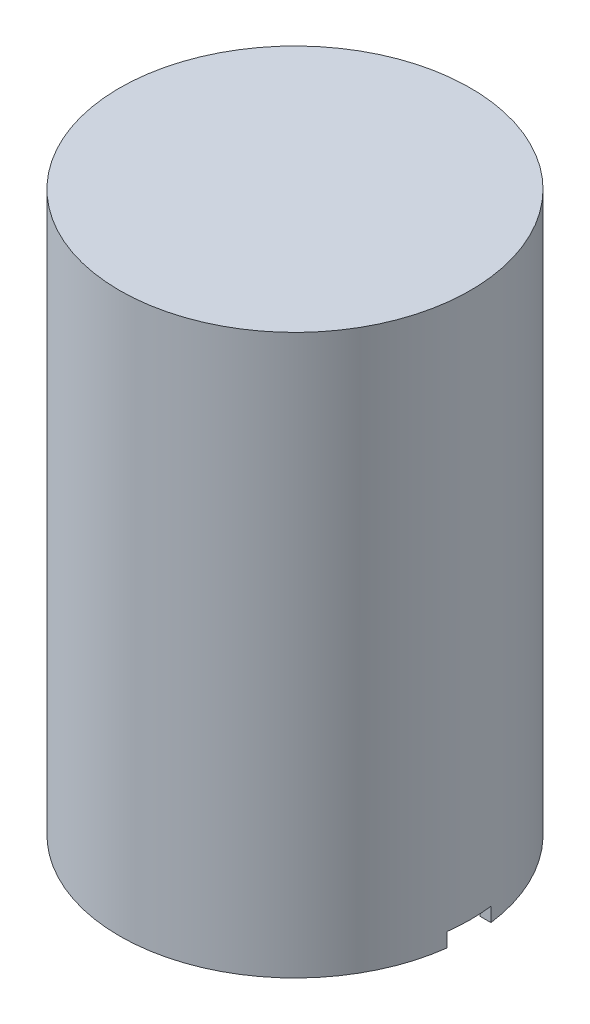
ISO-10303-21;
HEADER;
FILE_DESCRIPTION(('STEP AP214'),'2;1');
FILE_NAME('part.step','',(''),(''),'','','');
FILE_SCHEMA(('AUTOMOTIVE_DESIGN { 1 0 10303 214 1 1 1 1 }'));
ENDSEC;
DATA;
#1=APPLICATION_CONTEXT('core data for automotive mechanical design processes');
#2=APPLICATION_PROTOCOL_DEFINITION('international standard','automotive_design',2000,#1);
#3=PRODUCT_CONTEXT('',#1,'mechanical');
#4=PRODUCT('Part','Part','',(#3));
#5=PRODUCT_RELATED_PRODUCT_CATEGORY('part','',(#4));
#6=PRODUCT_DEFINITION_FORMATION('','',#4);
#7=PRODUCT_DEFINITION_CONTEXT('part definition',#1,'design');
#8=PRODUCT_DEFINITION('design','',#6,#7);
#9=PRODUCT_DEFINITION_SHAPE('','',#8);
#10=(LENGTH_UNIT() NAMED_UNIT(*) SI_UNIT(.MILLI.,.METRE.));
#11=(NAMED_UNIT(*) PLANE_ANGLE_UNIT() SI_UNIT($,.RADIAN.));
#12=(NAMED_UNIT(*) SI_UNIT($,.STERADIAN.) SOLID_ANGLE_UNIT());
#13=UNCERTAINTY_MEASURE_WITH_UNIT(LENGTH_MEASURE(1.E-05),#10,'distance_accuracy_value','');
#14=(GEOMETRIC_REPRESENTATION_CONTEXT(3) GLOBAL_UNCERTAINTY_ASSIGNED_CONTEXT((#13)) GLOBAL_UNIT_ASSIGNED_CONTEXT((#10,
#11,#12)) REPRESENTATION_CONTEXT('',''));
#15=CARTESIAN_POINT('',(0.,0.,0.));
#16=DIRECTION('',(0.,0.,1.));
#17=DIRECTION('',(1.,0.,0.));
#18=AXIS2_PLACEMENT_3D('',#15,#16,#17);
#19=CARTESIAN_POINT('',(0.,0.,0.));
#20=DIRECTION('',(0.,1.,0.));
#21=DIRECTION('',(0.,0.,1.));
#22=AXIS2_PLACEMENT_3D('',#19,#20,#21);
#23=PLANE('',#22);
#24=DIRECTION('',(1.,0.,0.));
#25=VECTOR('',#24,1.);
#26=CARTESIAN_POINT('',(0.,0.,-4.));
#27=LINE('',#26,#25);
#28=CARTESIAN_POINT('',(-31.7490157327751,0.,-4.));
#29=VERTEX_POINT('',#28);
#30=CARTESIAN_POINT('',(-29.7573625343376,0.,-4.));
#31=VERTEX_POINT('',#30);
#32=EDGE_CURVE('E56',#29,#31,#27,.T.);
#33=ORIENTED_EDGE('',*,*,#32,.F.);
#34=CARTESIAN_POINT('',(0.,0.,0.));
#35=DIRECTION('',(0.,1.,0.));
#36=DIRECTION('',(0.,0.,1.));
#37=AXIS2_PLACEMENT_3D('',#34,#35,#36);
#38=CIRCLE('',#37,32.);
#39=CARTESIAN_POINT('',(31.7490157327751,0.,-4.));
#40=VERTEX_POINT('',#39);
#41=EDGE_CURVE('E139',#40,#29,#38,.T.);
#42=ORIENTED_EDGE('',*,*,#41,.F.);
#43=CARTESIAN_POINT('',(29.7573625343376,0.,-4.));
#44=VERTEX_POINT('',#43);
#45=EDGE_CURVE('E99',#44,#40,#27,.T.);
#46=ORIENTED_EDGE('',*,*,#45,.F.);
#47=CARTESIAN_POINT('',(0.,0.,0.));
#48=DIRECTION('',(0.,-1.,0.));
#49=DIRECTION('',(0.,0.,-1.));
#50=AXIS2_PLACEMENT_3D('',#47,#48,#49);
#51=CIRCLE('',#50,30.025);
#52=EDGE_CURVE('E125',#31,#44,#51,.T.);
#53=ORIENTED_EDGE('',*,*,#52,.F.);
#54=EDGE_LOOP('',(#33,#42,#46,#53));
#55=FACE_BOUND('',#54,.T.);
#56=ADVANCED_FACE('F33',(#55),#23,.F.);
#57=CARTESIAN_POINT('',(0.,100.,0.));
#58=DIRECTION('',(0.,-1.,0.));
#59=DIRECTION('',(0.,0.,-1.));
#60=AXIS2_PLACEMENT_3D('',#57,#58,#59);
#61=CYLINDRICAL_SURFACE('',#60,32.);
#62=CARTESIAN_POINT('',(0.,2.59058077848007,0.));
#63=DIRECTION('',(0.,-1.,0.));
#64=DIRECTION('',(0.,0.,-1.));
#65=AXIS2_PLACEMENT_3D('',#62,#63,#64);
#66=CIRCLE('',#65,32.);
#67=CARTESIAN_POINT('',(-31.7490157327751,2.59058077848007,4.));
#68=VERTEX_POINT('',#67);
#69=CARTESIAN_POINT('',(-31.7490157327751,2.59058077848007,-4.));
#70=VERTEX_POINT('',#69);
#71=EDGE_CURVE('E122',#68,#70,#66,.T.);
#72=ORIENTED_EDGE('',*,*,#71,.F.);
#73=DIRECTION('',(0.,-1.,0.));
#74=VECTOR('',#73,1.);
#75=CARTESIAN_POINT('',(-31.7490157327751,100.,4.));
#76=LINE('',#75,#74);
#77=CARTESIAN_POINT('',(-31.7490157327751,0.,4.));
#78=VERTEX_POINT('',#77);
#79=EDGE_CURVE('E127',#68,#78,#76,.T.);
#80=ORIENTED_EDGE('',*,*,#79,.T.);
#81=CARTESIAN_POINT('',(31.7490157327751,0.,4.));
#82=VERTEX_POINT('',#81);
#83=EDGE_CURVE('E134',#78,#82,#38,.T.);
#84=ORIENTED_EDGE('',*,*,#83,.T.);
#85=DIRECTION('',(0.,-1.,0.));
#86=VECTOR('',#85,1.);
#87=CARTESIAN_POINT('',(31.7490157327751,100.,4.));
#88=LINE('',#87,#86);
#89=CARTESIAN_POINT('',(31.7490157327751,2.59058077848007,4.));
#90=VERTEX_POINT('',#89);
#91=EDGE_CURVE('E120',#82,#90,#88,.F.);
#92=ORIENTED_EDGE('',*,*,#91,.T.);
#93=CARTESIAN_POINT('',(31.7490157327751,2.59058077848007,-4.));
#94=VERTEX_POINT('',#93);
#95=EDGE_CURVE('E108',#94,#90,#66,.T.);
#96=ORIENTED_EDGE('',*,*,#95,.F.);
#97=DIRECTION('',(0.,-1.,0.));
#98=VECTOR('',#97,1.);
#99=CARTESIAN_POINT('',(31.7490157327751,100.,-4.));
#100=LINE('',#99,#98);
#101=EDGE_CURVE('E96',#40,#94,#100,.F.);
#102=ORIENTED_EDGE('',*,*,#101,.F.);
#103=ORIENTED_EDGE('',*,*,#41,.T.);
#104=DIRECTION('',(0.,-1.,0.));
#105=VECTOR('',#104,1.);
#106=CARTESIAN_POINT('',(-31.7490157327751,100.,-4.));
#107=LINE('',#106,#105);
#108=EDGE_CURVE('E171',#70,#29,#107,.T.);
#109=ORIENTED_EDGE('',*,*,#108,.F.);
#110=EDGE_LOOP('',(#72,#80,#84,#92,#96,#102,#103,#109));
#111=FACE_BOUND('',#110,.T.);
#112=CARTESIAN_POINT('',(0.,102.,0.));
#113=DIRECTION('',(0.,1.,0.));
#114=DIRECTION('',(0.,0.,1.));
#115=AXIS2_PLACEMENT_3D('',#112,#113,#114);
#116=CIRCLE('',#115,32.);
#117=CARTESIAN_POINT('',(0.,102.,32.));
#118=VERTEX_POINT('',#117);
#119=EDGE_CURVE('E121',#118,#118,#116,.T.);
#120=ORIENTED_EDGE('',*,*,#119,.F.);
#121=EDGE_LOOP('',(#120));
#122=FACE_BOUND('',#121,.T.);
#123=ADVANCED_FACE('F35',(#111,#122),#61,.T.);
#124=ORIENTED_EDGE('',*,*,#83,.F.);
#125=DIRECTION('',(1.,0.,0.));
#126=VECTOR('',#125,1.);
#127=CARTESIAN_POINT('',(0.,0.,4.));
#128=LINE('',#127,#126);
#129=CARTESIAN_POINT('',(-29.7573625343376,0.,4.));
#130=VERTEX_POINT('',#129);
#131=EDGE_CURVE('E168',#78,#130,#128,.T.);
#132=ORIENTED_EDGE('',*,*,#131,.T.);
#133=CARTESIAN_POINT('',(29.7573625343376,0.,4.));
#134=VERTEX_POINT('',#133);
#135=EDGE_CURVE('E135',#134,#130,#51,.T.);
#136=ORIENTED_EDGE('',*,*,#135,.F.);
#137=EDGE_CURVE('E167',#134,#82,#128,.T.);
#138=ORIENTED_EDGE('',*,*,#137,.T.);
#139=EDGE_LOOP('',(#124,#132,#136,#138));
#140=FACE_BOUND('',#139,.T.);
#141=ADVANCED_FACE('F166',(#140),#23,.F.);
#142=CARTESIAN_POINT('',(0.,59.,0.));
#143=DIRECTION('',(0.,-1.,0.));
#144=DIRECTION('',(0.,0.,-1.));
#145=AXIS2_PLACEMENT_3D('',#142,#143,#144);
#146=CYLINDRICAL_SURFACE('',#145,30.025);
#147=CARTESIAN_POINT('',(0.,59.,0.));
#148=DIRECTION('',(0.,-1.,0.));
#149=DIRECTION('',(0.,0.,-1.));
#150=AXIS2_PLACEMENT_3D('',#147,#148,#149);
#151=CIRCLE('',#150,30.025);
#152=CARTESIAN_POINT('',(0.,59.,-30.025));
#153=VERTEX_POINT('',#152);
#154=EDGE_CURVE('E131',#153,#153,#151,.T.);
#155=ORIENTED_EDGE('',*,*,#154,.F.);
#156=EDGE_LOOP('',(#155));
#157=FACE_BOUND('',#156,.T.);
#158=ORIENTED_EDGE('',*,*,#135,.T.);
#159=DIRECTION('',(0.,-1.,0.));
#160=VECTOR('',#159,1.);
#161=CARTESIAN_POINT('',(-29.7573625343376,59.,4.));
#162=LINE('',#161,#160);
#163=CARTESIAN_POINT('',(-29.7573625343376,2.59058077848007,4.));
#164=VERTEX_POINT('',#163);
#165=EDGE_CURVE('E11',#130,#164,#162,.F.);
#166=ORIENTED_EDGE('',*,*,#165,.T.);
#167=CARTESIAN_POINT('',(0.,2.59058077848007,0.));
#168=DIRECTION('',(0.,-1.,0.));
#169=DIRECTION('',(0.,0.,-1.));
#170=AXIS2_PLACEMENT_3D('',#167,#168,#169);
#171=CIRCLE('',#170,30.025);
#172=CARTESIAN_POINT('',(-29.7573625343376,2.59058077848007,-4.));
#173=VERTEX_POINT('',#172);
#174=EDGE_CURVE('E41',#173,#164,#171,.F.);
#175=ORIENTED_EDGE('',*,*,#174,.F.);
#176=DIRECTION('',(0.,-1.,0.));
#177=VECTOR('',#176,1.);
#178=CARTESIAN_POINT('',(-29.7573625343376,59.,-4.));
#179=LINE('',#178,#177);
#180=EDGE_CURVE('E145',#31,#173,#179,.F.);
#181=ORIENTED_EDGE('',*,*,#180,.F.);
#182=ORIENTED_EDGE('',*,*,#52,.T.);
#183=DIRECTION('',(0.,-1.,0.));
#184=VECTOR('',#183,1.);
#185=CARTESIAN_POINT('',(29.7573625343376,59.,-4.));
#186=LINE('',#185,#184);
#187=CARTESIAN_POINT('',(29.7573625343376,2.59058077848007,-4.));
#188=VERTEX_POINT('',#187);
#189=EDGE_CURVE('E140',#188,#44,#186,.T.);
#190=ORIENTED_EDGE('',*,*,#189,.F.);
#191=CARTESIAN_POINT('',(29.7573625343376,2.59058077848007,4.));
#192=VERTEX_POINT('',#191);
#193=EDGE_CURVE('E111',#192,#188,#171,.F.);
#194=ORIENTED_EDGE('',*,*,#193,.F.);
#195=DIRECTION('',(0.,-1.,0.));
#196=VECTOR('',#195,1.);
#197=CARTESIAN_POINT('',(29.7573625343376,59.,4.));
#198=LINE('',#197,#196);
#199=EDGE_CURVE('E143',#192,#134,#198,.T.);
#200=ORIENTED_EDGE('',*,*,#199,.T.);
#201=EDGE_LOOP('',(#158,#166,#175,#181,#182,#190,#194,#200));
#202=FACE_BOUND('',#201,.T.);
#203=ADVANCED_FACE('F161',(#157,#202),#146,.F.);
#204=CARTESIAN_POINT('',(0.,59.,0.));
#205=DIRECTION('',(0.,-1.,0.));
#206=DIRECTION('',(0.,0.,-1.));
#207=AXIS2_PLACEMENT_3D('',#204,#205,#206);
#208=PLANE('',#207);
#209=ORIENTED_EDGE('',*,*,#154,.T.);
#210=EDGE_LOOP('',(#209));
#211=FACE_BOUND('',#210,.T.);
#212=ADVANCED_FACE('F186',(#211),#208,.T.);
#213=CARTESIAN_POINT('',(0.,102.,0.));
#214=DIRECTION('',(0.,1.,0.));
#215=DIRECTION('',(0.,0.,1.));
#216=AXIS2_PLACEMENT_3D('',#213,#214,#215);
#217=PLANE('',#216);
#218=ORIENTED_EDGE('',*,*,#119,.T.);
#219=EDGE_LOOP('',(#218));
#220=FACE_BOUND('',#219,.T.);
#221=ADVANCED_FACE('F191',(#220),#217,.T.);
#222=CARTESIAN_POINT('',(0.,0.,4.));
#223=DIRECTION('',(0.,0.,1.));
#224=DIRECTION('',(1.,0.,0.));
#225=AXIS2_PLACEMENT_3D('',#222,#223,#224);
#226=PLANE('',#225);
#227=ORIENTED_EDGE('',*,*,#137,.F.);
#228=ORIENTED_EDGE('',*,*,#199,.F.);
#229=DIRECTION('',(-1.,0.,0.));
#230=VECTOR('',#229,1.);
#231=CARTESIAN_POINT('',(34.8707359606237,2.59058077848007,4.));
#232=LINE('',#231,#230);
#233=EDGE_CURVE('E158',#90,#192,#232,.T.);
#234=ORIENTED_EDGE('',*,*,#233,.F.);
#235=ORIENTED_EDGE('',*,*,#91,.F.);
#236=EDGE_LOOP('',(#227,#228,#234,#235));
#237=FACE_BOUND('',#236,.T.);
#238=ADVANCED_FACE('F198',(#237),#226,.F.);
#239=CARTESIAN_POINT('',(0.,0.,-4.));
#240=DIRECTION('',(0.,0.,1.));
#241=DIRECTION('',(1.,0.,0.));
#242=AXIS2_PLACEMENT_3D('',#239,#240,#241);
#243=PLANE('',#242);
#244=ORIENTED_EDGE('',*,*,#101,.T.);
#245=DIRECTION('',(-1.,0.,0.));
#246=VECTOR('',#245,1.);
#247=CARTESIAN_POINT('',(34.8707359606237,2.59058077848007,-4.));
#248=LINE('',#247,#246);
#249=EDGE_CURVE('E48',#94,#188,#248,.T.);
#250=ORIENTED_EDGE('',*,*,#249,.T.);
#251=ORIENTED_EDGE('',*,*,#189,.T.);
#252=ORIENTED_EDGE('',*,*,#45,.T.);
#253=EDGE_LOOP('',(#244,#250,#251,#252));
#254=FACE_BOUND('',#253,.T.);
#255=ADVANCED_FACE('F97',(#254),#243,.T.);
#256=CARTESIAN_POINT('',(34.8707359606237,2.59058077848007,4.));
#257=DIRECTION('',(0.,-1.,0.));
#258=DIRECTION('',(0.,0.,-1.));
#259=AXIS2_PLACEMENT_3D('',#256,#257,#258);
#260=PLANE('',#259);
#261=ORIENTED_EDGE('',*,*,#95,.T.);
#262=ORIENTED_EDGE('',*,*,#233,.T.);
#263=ORIENTED_EDGE('',*,*,#193,.T.);
#264=ORIENTED_EDGE('',*,*,#249,.F.);
#265=EDGE_LOOP('',(#261,#262,#263,#264));
#266=FACE_BOUND('',#265,.T.);
#267=ADVANCED_FACE('F106',(#266),#260,.T.);
#268=ORIENTED_EDGE('',*,*,#71,.T.);
#269=EDGE_CURVE('E114',#173,#70,#248,.T.);
#270=ORIENTED_EDGE('',*,*,#269,.F.);
#271=ORIENTED_EDGE('',*,*,#174,.T.);
#272=EDGE_CURVE('E113',#164,#68,#232,.T.);
#273=ORIENTED_EDGE('',*,*,#272,.T.);
#274=EDGE_LOOP('',(#268,#270,#271,#273));
#275=FACE_BOUND('',#274,.T.);
#276=ADVANCED_FACE('F152',(#275),#260,.T.);
#277=ORIENTED_EDGE('',*,*,#272,.F.);
#278=ORIENTED_EDGE('',*,*,#165,.F.);
#279=ORIENTED_EDGE('',*,*,#131,.F.);
#280=ORIENTED_EDGE('',*,*,#79,.F.);
#281=EDGE_LOOP('',(#277,#278,#279,#280));
#282=FACE_BOUND('',#281,.T.);
#283=ADVANCED_FACE('F155',(#282),#226,.F.);
#284=ORIENTED_EDGE('',*,*,#108,.T.);
#285=ORIENTED_EDGE('',*,*,#32,.T.);
#286=ORIENTED_EDGE('',*,*,#180,.T.);
#287=ORIENTED_EDGE('',*,*,#269,.T.);
#288=EDGE_LOOP('',(#284,#285,#286,#287));
#289=FACE_BOUND('',#288,.T.);
#290=ADVANCED_FACE('F174',(#289),#243,.T.);
#291=CLOSED_SHELL('',(#56,#123,#141,#203,#212,#221,#238,#255,#267,#276,#283,#290));
#292=MANIFOLD_SOLID_BREP('B2',#291);
#293=ADVANCED_BREP_SHAPE_REPRESENTATION('',(#18,#292),#14);
#294=SHAPE_DEFINITION_REPRESENTATION(#9,#293);
ENDSEC;
END-ISO-10303-21;
